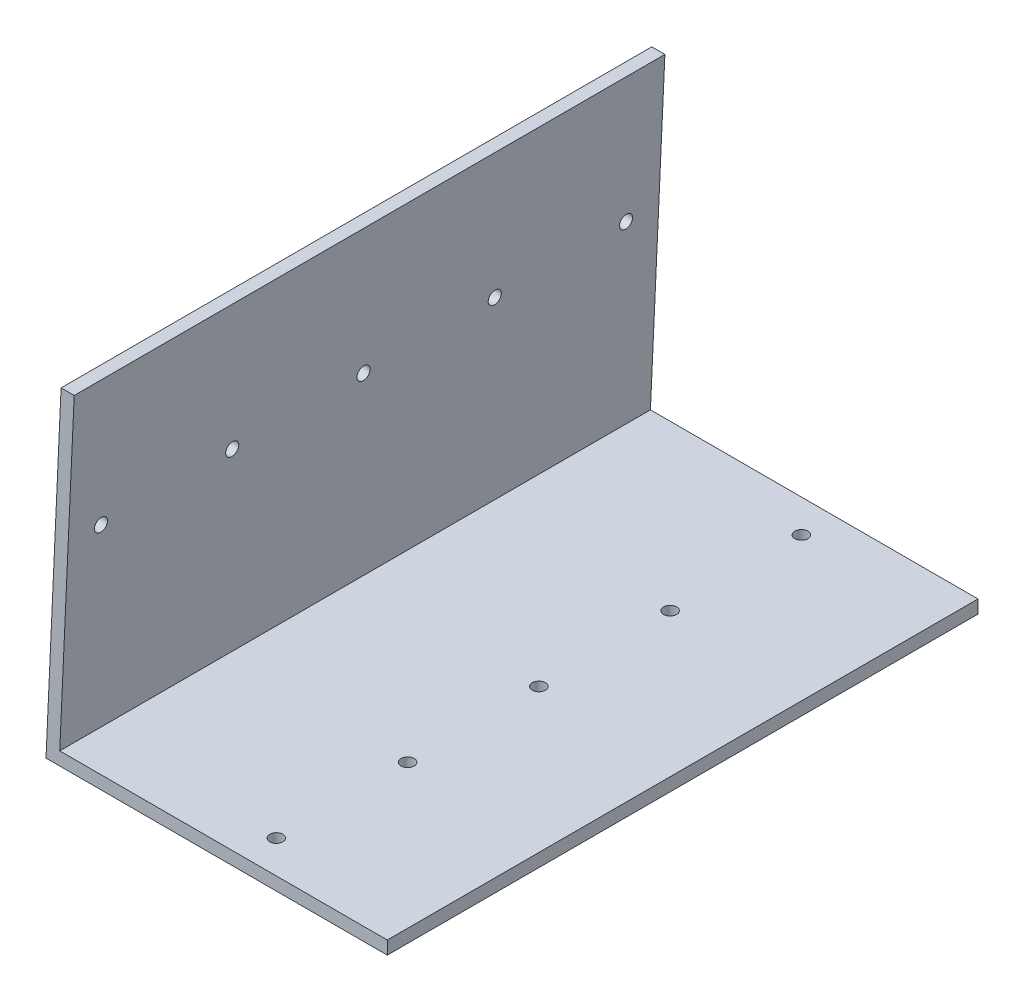
ISO-10303-21;
HEADER;
FILE_DESCRIPTION(('STEP AP214'),'2;1');
FILE_NAME('part.step','',(''),(''),'','','');
FILE_SCHEMA(('AUTOMOTIVE_DESIGN { 1 0 10303 214 1 1 1 1 }'));
ENDSEC;
DATA;
#1=APPLICATION_CONTEXT('core data for automotive mechanical design processes');
#2=APPLICATION_PROTOCOL_DEFINITION('international standard','automotive_design',2000,#1);
#3=PRODUCT_CONTEXT('',#1,'mechanical');
#4=PRODUCT('Part','Part','',(#3));
#5=PRODUCT_RELATED_PRODUCT_CATEGORY('part','',(#4));
#6=PRODUCT_DEFINITION_FORMATION('','',#4);
#7=PRODUCT_DEFINITION_CONTEXT('part definition',#1,'design');
#8=PRODUCT_DEFINITION('design','',#6,#7);
#9=PRODUCT_DEFINITION_SHAPE('','',#8);
#10=(LENGTH_UNIT() NAMED_UNIT(*) SI_UNIT(.MILLI.,.METRE.));
#11=(NAMED_UNIT(*) PLANE_ANGLE_UNIT() SI_UNIT($,.RADIAN.));
#12=(NAMED_UNIT(*) SI_UNIT($,.STERADIAN.) SOLID_ANGLE_UNIT());
#13=UNCERTAINTY_MEASURE_WITH_UNIT(LENGTH_MEASURE(1.E-05),#10,'distance_accuracy_value','');
#14=(GEOMETRIC_REPRESENTATION_CONTEXT(3) GLOBAL_UNCERTAINTY_ASSIGNED_CONTEXT((#13)) GLOBAL_UNIT_ASSIGNED_CONTEXT((#10,
#11,#12)) REPRESENTATION_CONTEXT('',''));
#15=CARTESIAN_POINT('',(0.,0.,0.));
#16=DIRECTION('',(0.,0.,1.));
#17=DIRECTION('',(1.,0.,0.));
#18=AXIS2_PLACEMENT_3D('',#15,#16,#17);
#19=CARTESIAN_POINT('',(0.,4.,150.));
#20=DIRECTION('',(0.,0.,-1.));
#21=DIRECTION('',(-1.,0.,0.));
#22=AXIS2_PLACEMENT_3D('',#19,#20,#21);
#23=PLANE('',#22);
#24=DIRECTION('',(1.,0.,0.));
#25=VECTOR('',#24,1.);
#26=CARTESIAN_POINT('',(0.,4.,150.));
#27=LINE('',#26,#25);
#28=CARTESIAN_POINT('',(-49.8162739774441,4.,150.));
#29=VERTEX_POINT('',#28);
#30=CARTESIAN_POINT('',(50.,4.,150.));
#31=VERTEX_POINT('',#30);
#32=EDGE_CURVE('E148',#29,#31,#27,.T.);
#33=ORIENTED_EDGE('',*,*,#32,.F.);
#34=DIRECTION('',(0.0458831312447982,0.998946814533773,0.));
#35=VECTOR('',#34,1.);
#36=CARTESIAN_POINT('',(-50.,0.,150.));
#37=LINE('',#36,#35);
#38=CARTESIAN_POINT('',(-45.4068494361021,100.,150.));
#39=VERTEX_POINT('',#38);
#40=EDGE_CURVE('E130',#29,#39,#37,.T.);
#41=ORIENTED_EDGE('',*,*,#40,.T.);
#42=DIRECTION('',(-1.,0.,0.));
#43=VECTOR('',#42,1.);
#44=CARTESIAN_POINT('',(-49.4068494361021,100.,150.));
#45=LINE('',#44,#43);
#46=CARTESIAN_POINT('',(-49.4068494361021,100.,150.));
#47=VERTEX_POINT('',#46);
#48=EDGE_CURVE('E117',#39,#47,#45,.T.);
#49=ORIENTED_EDGE('',*,*,#48,.T.);
#50=DIRECTION('',(-0.0458831312447982,-0.998946814533773,0.));
#51=VECTOR('',#50,1.);
#52=CARTESIAN_POINT('',(-54.,0.,150.));
#53=LINE('',#52,#51);
#54=CARTESIAN_POINT('',(-54.,0.,150.));
#55=VERTEX_POINT('',#54);
#56=EDGE_CURVE('E110',#47,#55,#53,.T.);
#57=ORIENTED_EDGE('',*,*,#56,.T.);
#58=DIRECTION('',(1.,0.,0.));
#59=VECTOR('',#58,1.);
#60=CARTESIAN_POINT('',(0.,0.,150.));
#61=LINE('',#60,#59);
#62=CARTESIAN_POINT('',(50.,0.,150.));
#63=VERTEX_POINT('',#62);
#64=EDGE_CURVE('E147',#55,#63,#61,.T.);
#65=ORIENTED_EDGE('',*,*,#64,.T.);
#66=DIRECTION('',(0.,-1.,0.));
#67=VECTOR('',#66,1.);
#68=CARTESIAN_POINT('',(50.,4.,150.));
#69=LINE('',#68,#67);
#70=EDGE_CURVE('E11',#31,#63,#69,.T.);
#71=ORIENTED_EDGE('',*,*,#70,.F.);
#72=EDGE_LOOP('',(#33,#41,#49,#57,#65,#71));
#73=FACE_BOUND('',#72,.T.);
#74=ADVANCED_FACE('F47',(#73),#23,.F.);
#75=CARTESIAN_POINT('',(50.,4.,0.));
#76=DIRECTION('',(-1.,0.,0.));
#77=DIRECTION('',(0.,0.,1.));
#78=AXIS2_PLACEMENT_3D('',#75,#76,#77);
#79=PLANE('',#78);
#80=DIRECTION('',(0.,0.,-1.));
#81=VECTOR('',#80,1.);
#82=CARTESIAN_POINT('',(50.,0.,0.));
#83=LINE('',#82,#81);
#84=CARTESIAN_POINT('',(50.,0.,-30.));
#85=VERTEX_POINT('',#84);
#86=EDGE_CURVE('E160',#63,#85,#83,.T.);
#87=ORIENTED_EDGE('',*,*,#86,.T.);
#88=DIRECTION('',(0.,-1.,0.));
#89=VECTOR('',#88,1.);
#90=CARTESIAN_POINT('',(50.,4.,-30.));
#91=LINE('',#90,#89);
#92=CARTESIAN_POINT('',(50.,4.,-30.));
#93=VERTEX_POINT('',#92);
#94=EDGE_CURVE('E56',#93,#85,#91,.T.);
#95=ORIENTED_EDGE('',*,*,#94,.F.);
#96=DIRECTION('',(0.,0.,-1.));
#97=VECTOR('',#96,1.);
#98=CARTESIAN_POINT('',(50.,4.,0.));
#99=LINE('',#98,#97);
#100=EDGE_CURVE('E151',#31,#93,#99,.T.);
#101=ORIENTED_EDGE('',*,*,#100,.F.);
#102=ORIENTED_EDGE('',*,*,#70,.T.);
#103=EDGE_LOOP('',(#87,#95,#101,#102));
#104=FACE_BOUND('',#103,.T.);
#105=ADVANCED_FACE('F232',(#104),#79,.F.);
#106=CARTESIAN_POINT('',(0.,4.,-30.));
#107=DIRECTION('',(0.,0.,-1.));
#108=DIRECTION('',(-1.,0.,0.));
#109=AXIS2_PLACEMENT_3D('',#106,#107,#108);
#110=PLANE('',#109);
#111=DIRECTION('',(1.,0.,0.));
#112=VECTOR('',#111,1.);
#113=CARTESIAN_POINT('',(0.,0.,-30.));
#114=LINE('',#113,#112);
#115=CARTESIAN_POINT('',(-54.,0.,-30.));
#116=VERTEX_POINT('',#115);
#117=EDGE_CURVE('E152',#116,#85,#114,.T.);
#118=ORIENTED_EDGE('',*,*,#117,.F.);
#119=DIRECTION('',(-0.0458831312447982,-0.998946814533773,0.));
#120=VECTOR('',#119,1.);
#121=CARTESIAN_POINT('',(-54.,0.,-30.));
#122=LINE('',#121,#120);
#123=CARTESIAN_POINT('',(-49.4068494361021,100.,-30.));
#124=VERTEX_POINT('',#123);
#125=EDGE_CURVE('E120',#124,#116,#122,.T.);
#126=ORIENTED_EDGE('',*,*,#125,.F.);
#127=DIRECTION('',(-1.,0.,0.));
#128=VECTOR('',#127,1.);
#129=CARTESIAN_POINT('',(-49.4068494361021,100.,-30.));
#130=LINE('',#129,#128);
#131=CARTESIAN_POINT('',(-45.4068494361021,100.,-30.));
#132=VERTEX_POINT('',#131);
#133=EDGE_CURVE('E109',#132,#124,#130,.T.);
#134=ORIENTED_EDGE('',*,*,#133,.F.);
#135=DIRECTION('',(0.0458831312447982,0.998946814533773,0.));
#136=VECTOR('',#135,1.);
#137=CARTESIAN_POINT('',(-50.,0.,-30.));
#138=LINE('',#137,#136);
#139=CARTESIAN_POINT('',(-49.8162739774441,4.,-30.));
#140=VERTEX_POINT('',#139);
#141=EDGE_CURVE('E100',#140,#132,#138,.T.);
#142=ORIENTED_EDGE('',*,*,#141,.F.);
#143=DIRECTION('',(1.,0.,0.));
#144=VECTOR('',#143,1.);
#145=CARTESIAN_POINT('',(0.,4.,-30.));
#146=LINE('',#145,#144);
#147=EDGE_CURVE('E64',#140,#93,#146,.T.);
#148=ORIENTED_EDGE('',*,*,#147,.T.);
#149=ORIENTED_EDGE('',*,*,#94,.T.);
#150=EDGE_LOOP('',(#118,#126,#134,#142,#148,#149));
#151=FACE_BOUND('',#150,.T.);
#152=ADVANCED_FACE('F122',(#151),#110,.T.);
#153=CARTESIAN_POINT('',(0.,4.,0.));
#154=DIRECTION('',(0.,1.,0.));
#155=DIRECTION('',(0.,0.,1.));
#156=AXIS2_PLACEMENT_3D('',#153,#154,#155);
#157=PLANE('',#156);
#158=CARTESIAN_POINT('',(6.1837260225559,4.,60.));
#159=DIRECTION('',(0.,1.,0.));
#160=DIRECTION('',(0.,0.,1.));
#161=AXIS2_PLACEMENT_3D('',#158,#159,#160);
#162=CIRCLE('',#161,1.99999999999999);
#163=CARTESIAN_POINT('',(6.1837260225559,4.,62.));
#164=VERTEX_POINT('',#163);
#165=EDGE_CURVE('E190',#164,#164,#162,.T.);
#166=ORIENTED_EDGE('',*,*,#165,.F.);
#167=EDGE_LOOP('',(#166));
#168=FACE_BOUND('',#167,.T.);
#169=CARTESIAN_POINT('',(6.1837260225559,4.,-20.));
#170=DIRECTION('',(0.,1.,0.));
#171=DIRECTION('',(0.,0.,1.));
#172=AXIS2_PLACEMENT_3D('',#169,#170,#171);
#173=CIRCLE('',#172,1.99999999999999);
#174=CARTESIAN_POINT('',(6.1837260225559,4.,-18.));
#175=VERTEX_POINT('',#174);
#176=EDGE_CURVE('E186',#175,#175,#173,.T.);
#177=ORIENTED_EDGE('',*,*,#176,.F.);
#178=EDGE_LOOP('',(#177));
#179=FACE_BOUND('',#178,.T.);
#180=CARTESIAN_POINT('',(6.1837260225559,4.,20.));
#181=DIRECTION('',(0.,1.,0.));
#182=DIRECTION('',(0.,0.,1.));
#183=AXIS2_PLACEMENT_3D('',#180,#181,#182);
#184=CIRCLE('',#183,1.99999999999999);
#185=CARTESIAN_POINT('',(6.1837260225559,4.,22.));
#186=VERTEX_POINT('',#185);
#187=EDGE_CURVE('E182',#186,#186,#184,.T.);
#188=ORIENTED_EDGE('',*,*,#187,.F.);
#189=EDGE_LOOP('',(#188));
#190=FACE_BOUND('',#189,.T.);
#191=CARTESIAN_POINT('',(6.18372602255591,4.,140.));
#192=DIRECTION('',(0.,1.,0.));
#193=DIRECTION('',(0.,0.,1.));
#194=AXIS2_PLACEMENT_3D('',#191,#192,#193);
#195=CIRCLE('',#194,1.99999999999999);
#196=CARTESIAN_POINT('',(6.18372602255591,4.,142.));
#197=VERTEX_POINT('',#196);
#198=EDGE_CURVE('E177',#197,#197,#195,.T.);
#199=ORIENTED_EDGE('',*,*,#198,.F.);
#200=EDGE_LOOP('',(#199));
#201=FACE_BOUND('',#200,.T.);
#202=CARTESIAN_POINT('',(6.18372602255591,4.,100.));
#203=DIRECTION('',(0.,1.,0.));
#204=DIRECTION('',(0.,0.,1.));
#205=AXIS2_PLACEMENT_3D('',#202,#203,#204);
#206=CIRCLE('',#205,1.99999999999999);
#207=CARTESIAN_POINT('',(6.18372602255591,4.,102.));
#208=VERTEX_POINT('',#207);
#209=EDGE_CURVE('E172',#208,#208,#206,.T.);
#210=ORIENTED_EDGE('',*,*,#209,.F.);
#211=EDGE_LOOP('',(#210));
#212=FACE_BOUND('',#211,.T.);
#213=DIRECTION('',(0.,0.,-1.));
#214=VECTOR('',#213,1.);
#215=CARTESIAN_POINT('',(-49.8162739774441,4.,0.));
#216=LINE('',#215,#214);
#217=EDGE_CURVE('E68',#29,#140,#216,.T.);
#218=ORIENTED_EDGE('',*,*,#217,.F.);
#219=ORIENTED_EDGE('',*,*,#32,.T.);
#220=ORIENTED_EDGE('',*,*,#100,.T.);
#221=ORIENTED_EDGE('',*,*,#147,.F.);
#222=EDGE_LOOP('',(#218,#219,#220,#221));
#223=FACE_BOUND('',#222,.T.);
#224=ADVANCED_FACE('F220',(#168,#179,#190,#201,#212,#223),#157,.T.);
#225=CARTESIAN_POINT('',(0.,0.,0.));
#226=DIRECTION('',(0.,1.,0.));
#227=DIRECTION('',(0.,0.,1.));
#228=AXIS2_PLACEMENT_3D('',#225,#226,#227);
#229=PLANE('',#228);
#230=CARTESIAN_POINT('',(6.1837260225559,0.,60.));
#231=DIRECTION('',(0.,1.,0.));
#232=DIRECTION('',(0.,0.,1.));
#233=AXIS2_PLACEMENT_3D('',#230,#231,#232);
#234=CIRCLE('',#233,1.99999999999999);
#235=CARTESIAN_POINT('',(6.1837260225559,0.,62.));
#236=VERTEX_POINT('',#235);
#237=EDGE_CURVE('E187',#236,#236,#234,.T.);
#238=ORIENTED_EDGE('',*,*,#237,.T.);
#239=EDGE_LOOP('',(#238));
#240=FACE_BOUND('',#239,.T.);
#241=CARTESIAN_POINT('',(6.1837260225559,0.,-20.));
#242=DIRECTION('',(0.,1.,0.));
#243=DIRECTION('',(0.,0.,1.));
#244=AXIS2_PLACEMENT_3D('',#241,#242,#243);
#245=CIRCLE('',#244,1.99999999999999);
#246=CARTESIAN_POINT('',(6.1837260225559,0.,-18.));
#247=VERTEX_POINT('',#246);
#248=EDGE_CURVE('E183',#247,#247,#245,.T.);
#249=ORIENTED_EDGE('',*,*,#248,.T.);
#250=EDGE_LOOP('',(#249));
#251=FACE_BOUND('',#250,.T.);
#252=CARTESIAN_POINT('',(6.1837260225559,0.,20.));
#253=DIRECTION('',(0.,1.,0.));
#254=DIRECTION('',(0.,0.,1.));
#255=AXIS2_PLACEMENT_3D('',#252,#253,#254);
#256=CIRCLE('',#255,1.99999999999999);
#257=CARTESIAN_POINT('',(6.1837260225559,0.,22.));
#258=VERTEX_POINT('',#257);
#259=EDGE_CURVE('E178',#258,#258,#256,.T.);
#260=ORIENTED_EDGE('',*,*,#259,.T.);
#261=EDGE_LOOP('',(#260));
#262=FACE_BOUND('',#261,.T.);
#263=CARTESIAN_POINT('',(6.18372602255591,0.,140.));
#264=DIRECTION('',(0.,1.,0.));
#265=DIRECTION('',(0.,0.,1.));
#266=AXIS2_PLACEMENT_3D('',#263,#264,#265);
#267=CIRCLE('',#266,1.99999999999999);
#268=CARTESIAN_POINT('',(6.18372602255591,0.,142.));
#269=VERTEX_POINT('',#268);
#270=EDGE_CURVE('E173',#269,#269,#267,.T.);
#271=ORIENTED_EDGE('',*,*,#270,.T.);
#272=EDGE_LOOP('',(#271));
#273=FACE_BOUND('',#272,.T.);
#274=CARTESIAN_POINT('',(6.18372602255591,0.,100.));
#275=DIRECTION('',(0.,1.,0.));
#276=DIRECTION('',(0.,0.,1.));
#277=AXIS2_PLACEMENT_3D('',#274,#275,#276);
#278=CIRCLE('',#277,1.99999999999999);
#279=CARTESIAN_POINT('',(6.18372602255591,0.,102.));
#280=VERTEX_POINT('',#279);
#281=EDGE_CURVE('E133',#280,#280,#278,.T.);
#282=ORIENTED_EDGE('',*,*,#281,.T.);
#283=EDGE_LOOP('',(#282));
#284=FACE_BOUND('',#283,.T.);
#285=ORIENTED_EDGE('',*,*,#64,.F.);
#286=DIRECTION('',(0.,0.,1.));
#287=VECTOR('',#286,1.);
#288=CARTESIAN_POINT('',(-54.,0.,-30.));
#289=LINE('',#288,#287);
#290=EDGE_CURVE('E139',#116,#55,#289,.T.);
#291=ORIENTED_EDGE('',*,*,#290,.F.);
#292=ORIENTED_EDGE('',*,*,#117,.T.);
#293=ORIENTED_EDGE('',*,*,#86,.F.);
#294=EDGE_LOOP('',(#285,#291,#292,#293));
#295=FACE_BOUND('',#294,.T.);
#296=ADVANCED_FACE('F222',(#240,#251,#262,#273,#284,#295),#229,.F.);
#297=CARTESIAN_POINT('',(-54.,0.,-30.));
#298=DIRECTION('',(-0.998946814533773,0.0458831312447982,0.));
#299=DIRECTION('',(-0.0458831312447982,-0.998946814533773,0.));
#300=AXIS2_PLACEMENT_3D('',#297,#298,#299);
#301=PLANE('',#300);
#302=CARTESIAN_POINT('',(-51.2383975808041,60.1243608450826,60.));
#303=DIRECTION('',(-0.998946814533773,0.0458831312447982,0.));
#304=DIRECTION('',(-0.0458831312447982,-0.998946814533773,0.));
#305=AXIS2_PLACEMENT_3D('',#302,#303,#304);
#306=CIRCLE('',#305,1.99999999999999);
#307=CARTESIAN_POINT('',(-51.3301638432937,58.1264672160151,60.));
#308=VERTEX_POINT('',#307);
#309=EDGE_CURVE('E50',#308,#308,#306,.T.);
#310=ORIENTED_EDGE('',*,*,#309,.F.);
#311=EDGE_LOOP('',(#310));
#312=FACE_BOUND('',#311,.T.);
#313=CARTESIAN_POINT('',(-51.2383975808041,60.1243608450826,20.));
#314=DIRECTION('',(-0.998946814533773,0.0458831312447982,0.));
#315=DIRECTION('',(-0.0458831312447982,-0.998946814533773,0.));
#316=AXIS2_PLACEMENT_3D('',#313,#314,#315);
#317=CIRCLE('',#316,1.99999999999999);
#318=CARTESIAN_POINT('',(-51.3301638432937,58.1264672160151,20.));
#319=VERTEX_POINT('',#318);
#320=EDGE_CURVE('E300',#319,#319,#317,.T.);
#321=ORIENTED_EDGE('',*,*,#320,.F.);
#322=EDGE_LOOP('',(#321));
#323=FACE_BOUND('',#322,.T.);
#324=CARTESIAN_POINT('',(-51.2383975808041,60.1243608450826,-20.));
#325=DIRECTION('',(-0.998946814533773,0.0458831312447982,0.));
#326=DIRECTION('',(-0.0458831312447982,-0.998946814533773,0.));
#327=AXIS2_PLACEMENT_3D('',#324,#325,#326);
#328=CIRCLE('',#327,1.99999999999999);
#329=CARTESIAN_POINT('',(-51.3301638432937,58.1264672160151,-20.));
#330=VERTEX_POINT('',#329);
#331=EDGE_CURVE('E294',#330,#330,#328,.T.);
#332=ORIENTED_EDGE('',*,*,#331,.F.);
#333=EDGE_LOOP('',(#332));
#334=FACE_BOUND('',#333,.T.);
#335=CARTESIAN_POINT('',(-51.2383975808041,60.1243608450826,100.));
#336=DIRECTION('',(-0.998946814533773,0.0458831312447982,0.));
#337=DIRECTION('',(-0.0458831312447982,-0.998946814533773,0.));
#338=AXIS2_PLACEMENT_3D('',#335,#336,#337);
#339=CIRCLE('',#338,1.99999999999999);
#340=CARTESIAN_POINT('',(-51.3301638432937,58.1264672160151,100.));
#341=VERTEX_POINT('',#340);
#342=EDGE_CURVE('E287',#341,#341,#339,.T.);
#343=ORIENTED_EDGE('',*,*,#342,.F.);
#344=EDGE_LOOP('',(#343));
#345=FACE_BOUND('',#344,.T.);
#346=CARTESIAN_POINT('',(-51.2383975808041,60.1243608450826,140.));
#347=DIRECTION('',(-0.998946814533773,0.0458831312447982,0.));
#348=DIRECTION('',(-0.0458831312447982,-0.998946814533773,0.));
#349=AXIS2_PLACEMENT_3D('',#346,#347,#348);
#350=CIRCLE('',#349,1.99999999999999);
#351=CARTESIAN_POINT('',(-51.3301638432937,58.1264672160151,140.));
#352=VERTEX_POINT('',#351);
#353=EDGE_CURVE('E198',#352,#352,#350,.T.);
#354=ORIENTED_EDGE('',*,*,#353,.F.);
#355=EDGE_LOOP('',(#354));
#356=FACE_BOUND('',#355,.T.);
#357=ORIENTED_EDGE('',*,*,#56,.F.);
#358=DIRECTION('',(0.,0.,1.));
#359=VECTOR('',#358,1.);
#360=CARTESIAN_POINT('',(-49.4068494361021,100.,-30.));
#361=LINE('',#360,#359);
#362=EDGE_CURVE('E119',#124,#47,#361,.T.);
#363=ORIENTED_EDGE('',*,*,#362,.F.);
#364=ORIENTED_EDGE('',*,*,#125,.T.);
#365=ORIENTED_EDGE('',*,*,#290,.T.);
#366=EDGE_LOOP('',(#357,#363,#364,#365));
#367=FACE_BOUND('',#366,.T.);
#368=ADVANCED_FACE('F229',(#312,#323,#334,#345,#356,#367),#301,.T.);
#369=CARTESIAN_POINT('',(-49.4068494361021,100.,-30.));
#370=DIRECTION('',(0.,1.,0.));
#371=DIRECTION('',(0.,0.,1.));
#372=AXIS2_PLACEMENT_3D('',#369,#370,#371);
#373=PLANE('',#372);
#374=ORIENTED_EDGE('',*,*,#48,.F.);
#375=DIRECTION('',(0.,0.,1.));
#376=VECTOR('',#375,1.);
#377=CARTESIAN_POINT('',(-45.4068494361021,100.,-30.));
#378=LINE('',#377,#376);
#379=EDGE_CURVE('E104',#132,#39,#378,.T.);
#380=ORIENTED_EDGE('',*,*,#379,.F.);
#381=ORIENTED_EDGE('',*,*,#133,.T.);
#382=ORIENTED_EDGE('',*,*,#362,.T.);
#383=EDGE_LOOP('',(#374,#380,#381,#382));
#384=FACE_BOUND('',#383,.T.);
#385=ADVANCED_FACE('F114',(#384),#373,.T.);
#386=CARTESIAN_POINT('',(-50.,0.,-30.));
#387=DIRECTION('',(0.998946814533773,-0.0458831312447982,0.));
#388=DIRECTION('',(0.0458831312447982,0.998946814533773,0.));
#389=AXIS2_PLACEMENT_3D('',#386,#387,#388);
#390=PLANE('',#389);
#391=CARTESIAN_POINT('',(-47.2468186277354,59.9410216138913,60.));
#392=DIRECTION('',(0.998946814533773,-0.0458831312447982,0.));
#393=DIRECTION('',(0.0458831312447982,0.998946814533773,0.));
#394=AXIS2_PLACEMENT_3D('',#391,#392,#393);
#395=CIRCLE('',#394,1.99999999999999);
#396=CARTESIAN_POINT('',(-47.1550523652458,61.9389152429588,60.));
#397=VERTEX_POINT('',#396);
#398=EDGE_CURVE('E270',#397,#397,#395,.T.);
#399=ORIENTED_EDGE('',*,*,#398,.F.);
#400=EDGE_LOOP('',(#399));
#401=FACE_BOUND('',#400,.T.);
#402=CARTESIAN_POINT('',(-47.2468186277354,59.9410216138913,20.));
#403=DIRECTION('',(0.998946814533773,-0.0458831312447982,0.));
#404=DIRECTION('',(0.0458831312447982,0.998946814533773,0.));
#405=AXIS2_PLACEMENT_3D('',#402,#403,#404);
#406=CIRCLE('',#405,1.99999999999999);
#407=CARTESIAN_POINT('',(-47.1550523652458,61.9389152429588,20.));
#408=VERTEX_POINT('',#407);
#409=EDGE_CURVE('E274',#408,#408,#406,.T.);
#410=ORIENTED_EDGE('',*,*,#409,.F.);
#411=EDGE_LOOP('',(#410));
#412=FACE_BOUND('',#411,.T.);
#413=CARTESIAN_POINT('',(-47.2468186277354,59.9410216138913,-20.));
#414=DIRECTION('',(0.998946814533773,-0.0458831312447982,0.));
#415=DIRECTION('',(0.0458831312447982,0.998946814533773,0.));
#416=AXIS2_PLACEMENT_3D('',#413,#414,#415);
#417=CIRCLE('',#416,1.99999999999999);
#418=CARTESIAN_POINT('',(-47.1550523652458,61.9389152429588,-20.));
#419=VERTEX_POINT('',#418);
#420=EDGE_CURVE('E278',#419,#419,#417,.T.);
#421=ORIENTED_EDGE('',*,*,#420,.F.);
#422=EDGE_LOOP('',(#421));
#423=FACE_BOUND('',#422,.T.);
#424=CARTESIAN_POINT('',(-47.2468186277354,59.9410216138913,100.));
#425=DIRECTION('',(0.998946814533773,-0.0458831312447982,0.));
#426=DIRECTION('',(0.0458831312447982,0.998946814533773,0.));
#427=AXIS2_PLACEMENT_3D('',#424,#425,#426);
#428=CIRCLE('',#427,1.99999999999999);
#429=CARTESIAN_POINT('',(-47.1550523652458,61.9389152429588,100.));
#430=VERTEX_POINT('',#429);
#431=EDGE_CURVE('E282',#430,#430,#428,.T.);
#432=ORIENTED_EDGE('',*,*,#431,.F.);
#433=EDGE_LOOP('',(#432));
#434=FACE_BOUND('',#433,.T.);
#435=CARTESIAN_POINT('',(-47.2468186277354,59.9410216138913,140.));
#436=DIRECTION('',(0.998946814533773,-0.0458831312447982,0.));
#437=DIRECTION('',(0.0458831312447982,0.998946814533773,0.));
#438=AXIS2_PLACEMENT_3D('',#435,#436,#437);
#439=CIRCLE('',#438,2.);
#440=CARTESIAN_POINT('',(-47.1550523652458,61.9389152429588,140.));
#441=VERTEX_POINT('',#440);
#442=EDGE_CURVE('E204',#441,#441,#439,.T.);
#443=ORIENTED_EDGE('',*,*,#442,.F.);
#444=EDGE_LOOP('',(#443));
#445=FACE_BOUND('',#444,.T.);
#446=ORIENTED_EDGE('',*,*,#40,.F.);
#447=ORIENTED_EDGE('',*,*,#217,.T.);
#448=ORIENTED_EDGE('',*,*,#141,.T.);
#449=ORIENTED_EDGE('',*,*,#379,.T.);
#450=EDGE_LOOP('',(#446,#447,#448,#449));
#451=FACE_BOUND('',#450,.T.);
#452=ADVANCED_FACE('F103',(#401,#412,#423,#434,#445,#451),#390,.T.);
#453=CARTESIAN_POINT('',(6.18372602255591,4.,100.));
#454=DIRECTION('',(0.,1.,0.));
#455=DIRECTION('',(0.,0.,1.));
#456=AXIS2_PLACEMENT_3D('',#453,#454,#455);
#457=CYLINDRICAL_SURFACE('',#456,1.99999999999999);
#458=ORIENTED_EDGE('',*,*,#209,.T.);
#459=EDGE_LOOP('',(#458));
#460=FACE_BOUND('',#459,.T.);
#461=ORIENTED_EDGE('',*,*,#281,.F.);
#462=EDGE_LOOP('',(#461));
#463=FACE_BOUND('',#462,.T.);
#464=ADVANCED_FACE('F217',(#460,#463),#457,.F.);
#465=CARTESIAN_POINT('',(6.18372602255591,4.,140.));
#466=DIRECTION('',(0.,1.,0.));
#467=DIRECTION('',(0.,0.,1.));
#468=AXIS2_PLACEMENT_3D('',#465,#466,#467);
#469=CYLINDRICAL_SURFACE('',#468,1.99999999999999);
#470=ORIENTED_EDGE('',*,*,#198,.T.);
#471=EDGE_LOOP('',(#470));
#472=FACE_BOUND('',#471,.T.);
#473=ORIENTED_EDGE('',*,*,#270,.F.);
#474=EDGE_LOOP('',(#473));
#475=FACE_BOUND('',#474,.T.);
#476=ADVANCED_FACE('F266',(#472,#475),#469,.F.);
#477=CARTESIAN_POINT('',(6.1837260225559,4.,20.));
#478=DIRECTION('',(0.,1.,0.));
#479=DIRECTION('',(0.,0.,1.));
#480=AXIS2_PLACEMENT_3D('',#477,#478,#479);
#481=CYLINDRICAL_SURFACE('',#480,1.99999999999999);
#482=ORIENTED_EDGE('',*,*,#187,.T.);
#483=EDGE_LOOP('',(#482));
#484=FACE_BOUND('',#483,.T.);
#485=ORIENTED_EDGE('',*,*,#259,.F.);
#486=EDGE_LOOP('',(#485));
#487=FACE_BOUND('',#486,.T.);
#488=ADVANCED_FACE('F337',(#484,#487),#481,.F.);
#489=CARTESIAN_POINT('',(6.1837260225559,4.,-20.));
#490=DIRECTION('',(0.,1.,0.));
#491=DIRECTION('',(0.,0.,1.));
#492=AXIS2_PLACEMENT_3D('',#489,#490,#491);
#493=CYLINDRICAL_SURFACE('',#492,1.99999999999999);
#494=ORIENTED_EDGE('',*,*,#176,.T.);
#495=EDGE_LOOP('',(#494));
#496=FACE_BOUND('',#495,.T.);
#497=ORIENTED_EDGE('',*,*,#248,.F.);
#498=EDGE_LOOP('',(#497));
#499=FACE_BOUND('',#498,.T.);
#500=ADVANCED_FACE('F334',(#496,#499),#493,.F.);
#501=CARTESIAN_POINT('',(6.1837260225559,4.,60.));
#502=DIRECTION('',(0.,1.,0.));
#503=DIRECTION('',(0.,0.,1.));
#504=AXIS2_PLACEMENT_3D('',#501,#502,#503);
#505=CYLINDRICAL_SURFACE('',#504,1.99999999999999);
#506=ORIENTED_EDGE('',*,*,#165,.T.);
#507=EDGE_LOOP('',(#506));
#508=FACE_BOUND('',#507,.T.);
#509=ORIENTED_EDGE('',*,*,#237,.F.);
#510=EDGE_LOOP('',(#509));
#511=FACE_BOUND('',#510,.T.);
#512=ADVANCED_FACE('F331',(#508,#511),#505,.F.);
#513=CARTESIAN_POINT('',(-47.2468186277354,59.9410216138913,140.));
#514=DIRECTION('',(0.998946814533773,-0.0458831312447982,0.));
#515=DIRECTION('',(0.0458831312447982,0.998946814533773,0.));
#516=AXIS2_PLACEMENT_3D('',#513,#514,#515);
#517=CYLINDRICAL_SURFACE('',#516,1.99999999999999);
#518=ORIENTED_EDGE('',*,*,#353,.T.);
#519=EDGE_LOOP('',(#518));
#520=FACE_BOUND('',#519,.T.);
#521=ORIENTED_EDGE('',*,*,#442,.T.);
#522=EDGE_LOOP('',(#521));
#523=FACE_BOUND('',#522,.T.);
#524=ADVANCED_FACE('F328',(#520,#523),#517,.F.);
#525=CARTESIAN_POINT('',(-47.2468186277354,59.9410216138913,100.));
#526=DIRECTION('',(0.998946814533773,-0.0458831312447982,0.));
#527=DIRECTION('',(0.0458831312447982,0.998946814533773,0.));
#528=AXIS2_PLACEMENT_3D('',#525,#526,#527);
#529=CYLINDRICAL_SURFACE('',#528,1.99999999999999);
#530=ORIENTED_EDGE('',*,*,#342,.T.);
#531=EDGE_LOOP('',(#530));
#532=FACE_BOUND('',#531,.T.);
#533=ORIENTED_EDGE('',*,*,#431,.T.);
#534=EDGE_LOOP('',(#533));
#535=FACE_BOUND('',#534,.T.);
#536=ADVANCED_FACE('F324',(#532,#535),#529,.F.);
#537=CARTESIAN_POINT('',(-47.2468186277354,59.9410216138913,-20.));
#538=DIRECTION('',(0.998946814533773,-0.0458831312447982,0.));
#539=DIRECTION('',(0.0458831312447982,0.998946814533773,0.));
#540=AXIS2_PLACEMENT_3D('',#537,#538,#539);
#541=CYLINDRICAL_SURFACE('',#540,1.99999999999999);
#542=ORIENTED_EDGE('',*,*,#331,.T.);
#543=EDGE_LOOP('',(#542));
#544=FACE_BOUND('',#543,.T.);
#545=ORIENTED_EDGE('',*,*,#420,.T.);
#546=EDGE_LOOP('',(#545));
#547=FACE_BOUND('',#546,.T.);
#548=ADVANCED_FACE('F318',(#544,#547),#541,.F.);
#549=CARTESIAN_POINT('',(-47.2468186277354,59.9410216138913,20.));
#550=DIRECTION('',(0.998946814533773,-0.0458831312447982,0.));
#551=DIRECTION('',(0.0458831312447982,0.998946814533773,0.));
#552=AXIS2_PLACEMENT_3D('',#549,#550,#551);
#553=CYLINDRICAL_SURFACE('',#552,1.99999999999999);
#554=ORIENTED_EDGE('',*,*,#320,.T.);
#555=EDGE_LOOP('',(#554));
#556=FACE_BOUND('',#555,.T.);
#557=ORIENTED_EDGE('',*,*,#409,.T.);
#558=EDGE_LOOP('',(#557));
#559=FACE_BOUND('',#558,.T.);
#560=ADVANCED_FACE('F313',(#556,#559),#553,.F.);
#561=CARTESIAN_POINT('',(-47.2468186277354,59.9410216138913,60.));
#562=DIRECTION('',(0.998946814533773,-0.0458831312447982,0.));
#563=DIRECTION('',(0.0458831312447982,0.998946814533773,0.));
#564=AXIS2_PLACEMENT_3D('',#561,#562,#563);
#565=CYLINDRICAL_SURFACE('',#564,1.99999999999999);
#566=ORIENTED_EDGE('',*,*,#309,.T.);
#567=EDGE_LOOP('',(#566));
#568=FACE_BOUND('',#567,.T.);
#569=ORIENTED_EDGE('',*,*,#398,.T.);
#570=EDGE_LOOP('',(#569));
#571=FACE_BOUND('',#570,.T.);
#572=ADVANCED_FACE('F311',(#568,#571),#565,.F.);
#573=CLOSED_SHELL('',(#74,#105,#152,#224,#296,#368,#385,#452,#464,#476,#488,#500,#512,#524,#536,
#548,#560,#572));
#574=MANIFOLD_SOLID_BREP('B2',#573);
#575=ADVANCED_BREP_SHAPE_REPRESENTATION('',(#18,#574),#14);
#576=SHAPE_DEFINITION_REPRESENTATION(#9,#575);
ENDSEC;
END-ISO-10303-21;
